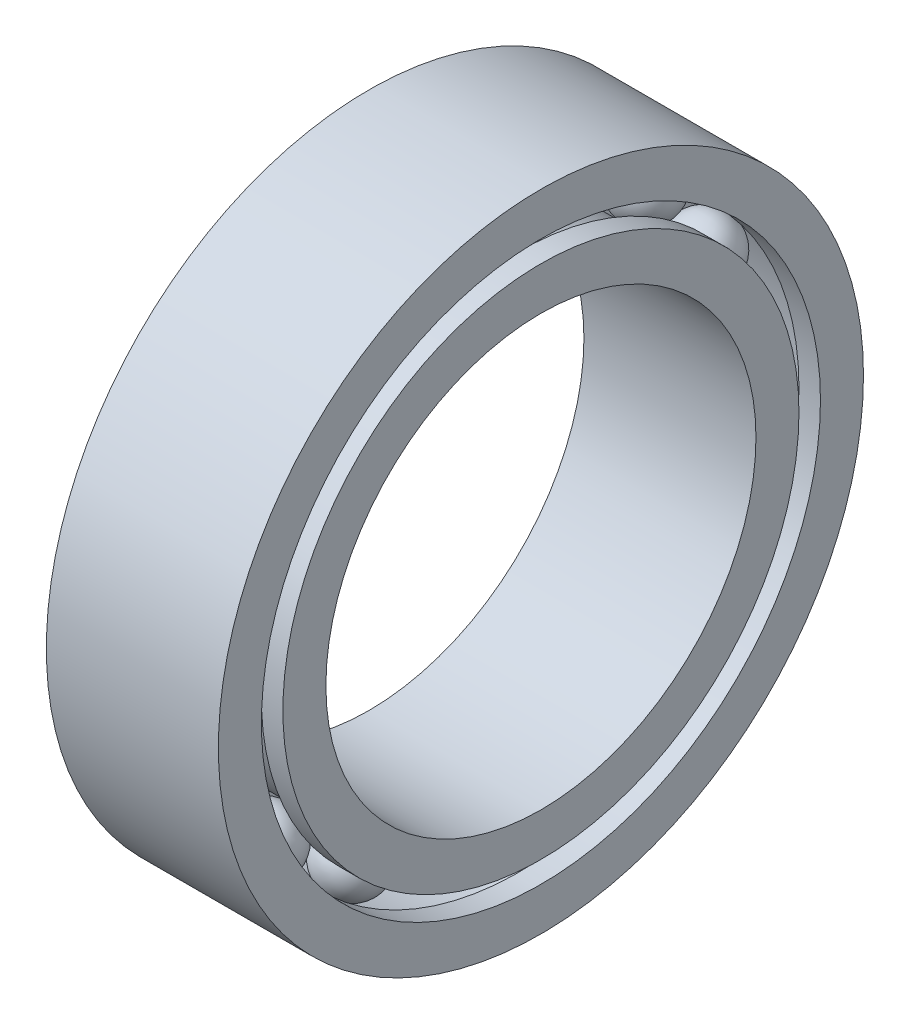
ISO-10303-21;
HEADER;
FILE_DESCRIPTION(('STEP AP214'),'2;1');
FILE_NAME('part.step','',(''),(''),'','','');
FILE_SCHEMA(('AUTOMOTIVE_DESIGN { 1 0 10303 214 1 1 1 1 }'));
ENDSEC;
DATA;
#1=APPLICATION_CONTEXT('core data for automotive mechanical design processes');
#2=APPLICATION_PROTOCOL_DEFINITION('international standard','automotive_design',2000,#1);
#3=PRODUCT_CONTEXT('',#1,'mechanical');
#4=PRODUCT('Part','Part','',(#3));
#5=PRODUCT_RELATED_PRODUCT_CATEGORY('part','',(#4));
#6=PRODUCT_DEFINITION_FORMATION('','',#4);
#7=PRODUCT_DEFINITION_CONTEXT('part definition',#1,'design');
#8=PRODUCT_DEFINITION('design','',#6,#7);
#9=PRODUCT_DEFINITION_SHAPE('','',#8);
#10=(LENGTH_UNIT() NAMED_UNIT(*) SI_UNIT(.MILLI.,.METRE.));
#11=(NAMED_UNIT(*) PLANE_ANGLE_UNIT() SI_UNIT($,.RADIAN.));
#12=(NAMED_UNIT(*) SI_UNIT($,.STERADIAN.) SOLID_ANGLE_UNIT());
#13=UNCERTAINTY_MEASURE_WITH_UNIT(LENGTH_MEASURE(1.E-05),#10,'distance_accuracy_value','');
#14=(GEOMETRIC_REPRESENTATION_CONTEXT(3) GLOBAL_UNCERTAINTY_ASSIGNED_CONTEXT((#13)) GLOBAL_UNIT_ASSIGNED_CONTEXT((#10,
#11,#12)) REPRESENTATION_CONTEXT('',''));
#15=CARTESIAN_POINT('',(0.,0.,0.));
#16=DIRECTION('',(0.,0.,1.));
#17=DIRECTION('',(1.,0.,0.));
#18=AXIS2_PLACEMENT_3D('',#15,#16,#17);
#19=CARTESIAN_POINT('',(0.,5.77424707819557,-2.39177145228173));
#20=DIRECTION('',(0.,0.923879532511292,-0.382683432365077));
#21=DIRECTION('',(0.,-0.382683432365077,-0.923879532511292));
#22=AXIS2_PLACEMENT_3D('',#19,#20,#21);
#23=SPHERICAL_SURFACE('',#22,0.750000000000001);
#24=CARTESIAN_POINT('',(0.,6.46715672757905,-2.67878402655554));
#25=VERTEX_POINT('',#24);
#26=VERTEX_LOOP('',#25);
#27=FACE_BOUND('',#26,.T.);
#28=ADVANCED_FACE('F72',(#27),#23,.T.);
#29=CLOSED_SHELL('',(#28));
#30=MANIFOLD_SOLID_BREP('B2',#29);
#31=CARTESIAN_POINT('',(0.,4.41941738241598,-4.41941738241587));
#32=DIRECTION('',(0.,0.707106781186556,-0.707106781186539));
#33=DIRECTION('',(0.,-0.707106781186539,-0.707106781186556));
#34=AXIS2_PLACEMENT_3D('',#31,#32,#33);
#35=SPHERICAL_SURFACE('',#34,0.750000000000001);
#36=CARTESIAN_POINT('',(0.,4.94974746830589,-4.94974746830577));
#37=VERTEX_POINT('',#36);
#38=VERTEX_LOOP('',#37);
#39=FACE_BOUND('',#38,.T.);
#40=ADVANCED_FACE('F87',(#39),#35,.T.);
#41=CLOSED_SHELL('',(#40));
#42=MANIFOLD_SOLID_BREP('B7',#41);
#43=CARTESIAN_POINT('',(0.,2.39177145228187,-5.77424707819552));
#44=DIRECTION('',(0.,0.3826834323651,-0.923879532511283));
#45=DIRECTION('',(0.,-0.923879532511283,-0.3826834323651));
#46=AXIS2_PLACEMENT_3D('',#43,#44,#45);
#47=SPHERICAL_SURFACE('',#46,0.750000000000001);
#48=CARTESIAN_POINT('',(0.,2.6787840265557,-6.46715672757898));
#49=VERTEX_POINT('',#48);
#50=VERTEX_LOOP('',#49);
#51=FACE_BOUND('',#50,.T.);
#52=ADVANCED_FACE('F102',(#51),#47,.T.);
#53=CLOSED_SHELL('',(#52));
#54=MANIFOLD_SOLID_BREP('B67',#53);
#55=CARTESIAN_POINT('',(0.,0.,-6.25));
#56=DIRECTION('',(0.,0.,-1.));
#57=DIRECTION('',(0.,-1.,0.));
#58=AXIS2_PLACEMENT_3D('',#55,#56,#57);
#59=SPHERICAL_SURFACE('',#58,0.750000000000001);
#60=CARTESIAN_POINT('',(0.,0.,-7.));
#61=VERTEX_POINT('',#60);
#62=VERTEX_LOOP('',#61);
#63=FACE_BOUND('',#62,.T.);
#64=ADVANCED_FACE('F122',(#63),#59,.T.);
#65=CLOSED_SHELL('',(#64));
#66=MANIFOLD_SOLID_BREP('B83',#65);
#67=CARTESIAN_POINT('',(0.,-2.39177145228175,-5.77424707819557));
#68=DIRECTION('',(0.,-0.382683432365081,-0.923879532511291));
#69=DIRECTION('',(0.,-0.923879532511291,0.382683432365081));
#70=AXIS2_PLACEMENT_3D('',#67,#68,#69);
#71=SPHERICAL_SURFACE('',#70,0.750000000000001);
#72=CARTESIAN_POINT('',(0.,-2.67878402655556,-6.46715672757904));
#73=VERTEX_POINT('',#72);
#74=VERTEX_LOOP('',#73);
#75=FACE_BOUND('',#74,.T.);
#76=ADVANCED_FACE('F140',(#75),#71,.T.);
#77=CLOSED_SHELL('',(#76));
#78=MANIFOLD_SOLID_BREP('B103',#77);
#79=CARTESIAN_POINT('',(0.,-4.41941738241588,-4.41941738241596));
#80=DIRECTION('',(0.,-0.707106781186541,-0.707106781186554));
#81=DIRECTION('',(0.,-0.707106781186554,0.707106781186541));
#82=AXIS2_PLACEMENT_3D('',#79,#80,#81);
#83=SPHERICAL_SURFACE('',#82,0.750000000000001);
#84=CARTESIAN_POINT('',(0.,-4.94974746830579,-4.94974746830588));
#85=VERTEX_POINT('',#84);
#86=VERTEX_LOOP('',#85);
#87=FACE_BOUND('',#86,.T.);
#88=ADVANCED_FACE('F151',(#87),#83,.T.);
#89=CLOSED_SHELL('',(#88));
#90=MANIFOLD_SOLID_BREP('B120',#89);
#91=CARTESIAN_POINT('',(0.,-5.77424707819552,-2.39177145228186));
#92=DIRECTION('',(0.,-0.923879532511284,-0.382683432365097));
#93=DIRECTION('',(0.,-0.382683432365097,0.923879532511284));
#94=AXIS2_PLACEMENT_3D('',#91,#92,#93);
#95=SPHERICAL_SURFACE('',#94,0.750000000000001);
#96=CARTESIAN_POINT('',(0.,-6.46715672757899,-2.67878402655568));
#97=VERTEX_POINT('',#96);
#98=VERTEX_LOOP('',#97);
#99=FACE_BOUND('',#98,.T.);
#100=ADVANCED_FACE('F169',(#99),#95,.T.);
#101=CLOSED_SHELL('',(#100));
#102=MANIFOLD_SOLID_BREP('B131',#101);
#103=CARTESIAN_POINT('',(0.,-6.25,0.));
#104=DIRECTION('',(0.,-1.,0.));
#105=DIRECTION('',(0.,0.,1.));
#106=AXIS2_PLACEMENT_3D('',#103,#104,#105);
#107=SPHERICAL_SURFACE('',#106,0.750000000000001);
#108=CARTESIAN_POINT('',(0.,-7.,0.));
#109=VERTEX_POINT('',#108);
#110=VERTEX_LOOP('',#109);
#111=FACE_BOUND('',#110,.T.);
#112=ADVANCED_FACE('F184',(#111),#107,.T.);
#113=CLOSED_SHELL('',(#112));
#114=MANIFOLD_SOLID_BREP('B146',#113);
#115=CARTESIAN_POINT('',(0.,-5.77424707819556,2.39177145228178));
#116=DIRECTION('',(0.,-0.923879532511289,0.382683432365084));
#117=DIRECTION('',(0.,0.382683432365084,0.923879532511289));
#118=AXIS2_PLACEMENT_3D('',#115,#116,#117);
#119=SPHERICAL_SURFACE('',#118,0.750000000000001);
#120=CARTESIAN_POINT('',(0.,-6.46715672757902,2.67878402655559));
#121=VERTEX_POINT('',#120);
#122=VERTEX_LOOP('',#121);
#123=FACE_BOUND('',#122,.T.);
#124=ADVANCED_FACE('F201',(#123),#119,.T.);
#125=CLOSED_SHELL('',(#124));
#126=MANIFOLD_SOLID_BREP('B164',#125);
#127=CARTESIAN_POINT('',(0.,-4.41941738241595,4.4194173824159));
#128=DIRECTION('',(0.,-0.707106781186551,0.707106781186544));
#129=DIRECTION('',(0.,0.707106781186544,0.707106781186551));
#130=AXIS2_PLACEMENT_3D('',#127,#128,#129);
#131=SPHERICAL_SURFACE('',#130,0.750000000000001);
#132=CARTESIAN_POINT('',(0.,-4.94974746830586,4.94974746830581));
#133=VERTEX_POINT('',#132);
#134=VERTEX_LOOP('',#133);
#135=FACE_BOUND('',#134,.T.);
#136=ADVANCED_FACE('F220',(#135),#131,.T.);
#137=CLOSED_SHELL('',(#136));
#138=MANIFOLD_SOLID_BREP('B181',#137);
#139=CARTESIAN_POINT('',(0.,-2.39177145228184,5.77424707819553));
#140=DIRECTION('',(0.,-0.382683432365094,0.923879532511285));
#141=DIRECTION('',(0.,0.923879532511285,0.382683432365094));
#142=AXIS2_PLACEMENT_3D('',#139,#140,#141);
#143=SPHERICAL_SURFACE('',#142,0.750000000000001);
#144=CARTESIAN_POINT('',(0.,-2.67878402655566,6.467156727579));
#145=VERTEX_POINT('',#144);
#146=VERTEX_LOOP('',#145);
#147=FACE_BOUND('',#146,.T.);
#148=ADVANCED_FACE('F231',(#147),#143,.T.);
#149=CLOSED_SHELL('',(#148));
#150=MANIFOLD_SOLID_BREP('B200',#149);
#151=CARTESIAN_POINT('',(0.,0.,6.25));
#152=DIRECTION('',(0.,0.,1.));
#153=DIRECTION('',(0.,1.,0.));
#154=AXIS2_PLACEMENT_3D('',#151,#152,#153);
#155=SPHERICAL_SURFACE('',#154,0.750000000000001);
#156=CARTESIAN_POINT('',(0.,0.,7.));
#157=VERTEX_POINT('',#156);
#158=VERTEX_LOOP('',#157);
#159=FACE_BOUND('',#158,.T.);
#160=ADVANCED_FACE('F248',(#159),#155,.T.);
#161=CLOSED_SHELL('',(#160));
#162=MANIFOLD_SOLID_BREP('B214',#161);
#163=CARTESIAN_POINT('',(0.,2.3917714522818,5.77424707819555));
#164=DIRECTION('',(0.,0.382683432365087,0.923879532511288));
#165=DIRECTION('',(0.,0.923879532511288,-0.382683432365087));
#166=AXIS2_PLACEMENT_3D('',#163,#164,#165);
#167=SPHERICAL_SURFACE('',#166,0.750000000000001);
#168=CARTESIAN_POINT('',(0.,2.67878402655561,6.46715672757901));
#169=VERTEX_POINT('',#168);
#170=VERTEX_LOOP('',#169);
#171=FACE_BOUND('',#170,.T.);
#172=ADVANCED_FACE('F264',(#171),#167,.T.);
#173=CLOSED_SHELL('',(#172));
#174=MANIFOLD_SOLID_BREP('B230',#173);
#175=CARTESIAN_POINT('',(0.,4.41941738241592,4.41941738241593));
#176=DIRECTION('',(0.,0.707106781186546,0.707106781186549));
#177=DIRECTION('',(0.,0.707106781186549,-0.707106781186546));
#178=AXIS2_PLACEMENT_3D('',#175,#176,#177);
#179=SPHERICAL_SURFACE('',#178,0.750000000000001);
#180=CARTESIAN_POINT('',(0.,4.94974746830583,4.94974746830584));
#181=VERTEX_POINT('',#180);
#182=VERTEX_LOOP('',#181);
#183=FACE_BOUND('',#182,.T.);
#184=ADVANCED_FACE('F283',(#183),#179,.T.);
#185=CLOSED_SHELL('',(#184));
#186=MANIFOLD_SOLID_BREP('B244',#185);
#187=CARTESIAN_POINT('',(0.,5.77424707819554,2.39177145228182));
#188=DIRECTION('',(0.,0.923879532511287,0.382683432365091));
#189=DIRECTION('',(0.,0.382683432365091,-0.923879532511287));
#190=AXIS2_PLACEMENT_3D('',#187,#188,#189);
#191=SPHERICAL_SURFACE('',#190,0.750000000000001);
#192=CARTESIAN_POINT('',(0.,6.46715672757901,2.67878402655564));
#193=VERTEX_POINT('',#192);
#194=VERTEX_LOOP('',#193);
#195=FACE_BOUND('',#194,.T.);
#196=ADVANCED_FACE('F299',(#195),#191,.T.);
#197=CLOSED_SHELL('',(#196));
#198=MANIFOLD_SOLID_BREP('B263',#197);
#199=CARTESIAN_POINT('',(-2.,0.,0.));
#200=DIRECTION('',(1.,0.,0.));
#201=DIRECTION('',(0.,0.,-1.));
#202=AXIS2_PLACEMENT_3D('',#199,#200,#201);
#203=CYLINDRICAL_SURFACE('',#202,7.);
#204=CARTESIAN_POINT('',(-1.5,0.,0.));
#205=DIRECTION('',(-1.,0.,0.));
#206=DIRECTION('',(0.,0.,1.));
#207=AXIS2_PLACEMENT_3D('',#204,#205,#206);
#208=CIRCLE('',#207,7.);
#209=CARTESIAN_POINT('',(-1.5,0.,7.));
#210=VERTEX_POINT('',#209);
#211=EDGE_CURVE('E323',#210,#210,#208,.F.);
#212=ORIENTED_EDGE('',*,*,#211,.F.);
#213=EDGE_LOOP('',(#212));
#214=FACE_BOUND('',#213,.T.);
#215=CARTESIAN_POINT('',(1.5,0.,0.));
#216=DIRECTION('',(1.,0.,0.));
#217=DIRECTION('',(0.,0.,-1.));
#218=AXIS2_PLACEMENT_3D('',#215,#216,#217);
#219=CIRCLE('',#218,7.);
#220=CARTESIAN_POINT('',(1.5,0.,-7.));
#221=VERTEX_POINT('',#220);
#222=EDGE_CURVE('E296',#221,#221,#219,.F.);
#223=ORIENTED_EDGE('',*,*,#222,.F.);
#224=EDGE_LOOP('',(#223));
#225=FACE_BOUND('',#224,.T.);
#226=ADVANCED_FACE('F319',(#214,#225),#203,.F.);
#227=CARTESIAN_POINT('',(-2.,0.,0.));
#228=DIRECTION('',(1.,0.,0.));
#229=DIRECTION('',(0.,0.,-1.));
#230=AXIS2_PLACEMENT_3D('',#227,#228,#229);
#231=CYLINDRICAL_SURFACE('',#230,7.5);
#232=CARTESIAN_POINT('',(-2.,0.,0.));
#233=DIRECTION('',(1.,0.,0.));
#234=DIRECTION('',(0.,0.,-1.));
#235=AXIS2_PLACEMENT_3D('',#232,#233,#234);
#236=CIRCLE('',#235,7.5);
#237=CARTESIAN_POINT('',(-2.,0.,-7.5));
#238=VERTEX_POINT('',#237);
#239=EDGE_CURVE('E329',#238,#238,#236,.T.);
#240=ORIENTED_EDGE('',*,*,#239,.T.);
#241=EDGE_LOOP('',(#240));
#242=FACE_BOUND('',#241,.T.);
#243=CARTESIAN_POINT('',(2.,0.,0.));
#244=DIRECTION('',(1.,0.,0.));
#245=DIRECTION('',(0.,0.,-1.));
#246=AXIS2_PLACEMENT_3D('',#243,#244,#245);
#247=CIRCLE('',#246,7.5);
#248=CARTESIAN_POINT('',(2.,0.,-7.5));
#249=VERTEX_POINT('',#248);
#250=EDGE_CURVE('E334',#249,#249,#247,.T.);
#251=ORIENTED_EDGE('',*,*,#250,.F.);
#252=EDGE_LOOP('',(#251));
#253=FACE_BOUND('',#252,.T.);
#254=ADVANCED_FACE('F379',(#242,#253),#231,.T.);
#255=CARTESIAN_POINT('',(-2.,0.,0.));
#256=DIRECTION('',(1.,0.,0.));
#257=DIRECTION('',(0.,0.,-1.));
#258=AXIS2_PLACEMENT_3D('',#255,#256,#257);
#259=PLANE('',#258);
#260=ORIENTED_EDGE('',*,*,#239,.F.);
#261=EDGE_LOOP('',(#260));
#262=FACE_BOUND('',#261,.T.);
#263=CARTESIAN_POINT('',(-2.,0.,0.));
#264=DIRECTION('',(-1.,0.,0.));
#265=DIRECTION('',(0.,0.,1.));
#266=AXIS2_PLACEMENT_3D('',#263,#264,#265);
#267=CIRCLE('',#266,6.5);
#268=CARTESIAN_POINT('',(-2.,0.,6.5));
#269=VERTEX_POINT('',#268);
#270=EDGE_CURVE('E345',#269,#269,#267,.T.);
#271=ORIENTED_EDGE('',*,*,#270,.F.);
#272=EDGE_LOOP('',(#271));
#273=FACE_BOUND('',#272,.T.);
#274=ADVANCED_FACE('F369',(#262,#273),#259,.F.);
#275=CARTESIAN_POINT('',(2.,0.,0.));
#276=DIRECTION('',(1.,0.,0.));
#277=DIRECTION('',(0.,0.,-1.));
#278=AXIS2_PLACEMENT_3D('',#275,#276,#277);
#279=PLANE('',#278);
#280=ORIENTED_EDGE('',*,*,#250,.T.);
#281=EDGE_LOOP('',(#280));
#282=FACE_BOUND('',#281,.T.);
#283=CARTESIAN_POINT('',(2.,0.,0.));
#284=DIRECTION('',(1.,0.,0.));
#285=DIRECTION('',(0.,0.,-1.));
#286=AXIS2_PLACEMENT_3D('',#283,#284,#285);
#287=CIRCLE('',#286,6.5);
#288=CARTESIAN_POINT('',(2.,0.,-6.5));
#289=VERTEX_POINT('',#288);
#290=EDGE_CURVE('E349',#289,#289,#287,.T.);
#291=ORIENTED_EDGE('',*,*,#290,.F.);
#292=EDGE_LOOP('',(#291));
#293=FACE_BOUND('',#292,.T.);
#294=ADVANCED_FACE('F370',(#282,#293),#279,.T.);
#295=CARTESIAN_POINT('',(-1.5,0.,0.));
#296=DIRECTION('',(-1.,0.,0.));
#297=DIRECTION('',(0.,0.,1.));
#298=AXIS2_PLACEMENT_3D('',#295,#296,#297);
#299=CYLINDRICAL_SURFACE('',#298,6.5);
#300=CARTESIAN_POINT('',(-1.5,0.,0.));
#301=DIRECTION('',(-1.,0.,0.));
#302=DIRECTION('',(0.,0.,1.));
#303=AXIS2_PLACEMENT_3D('',#300,#301,#302);
#304=CIRCLE('',#303,6.5);
#305=CARTESIAN_POINT('',(-1.5,0.,6.5));
#306=VERTEX_POINT('',#305);
#307=EDGE_CURVE('E342',#306,#306,#304,.T.);
#308=ORIENTED_EDGE('',*,*,#307,.F.);
#309=EDGE_LOOP('',(#308));
#310=FACE_BOUND('',#309,.T.);
#311=ORIENTED_EDGE('',*,*,#270,.T.);
#312=EDGE_LOOP('',(#311));
#313=FACE_BOUND('',#312,.T.);
#314=ADVANCED_FACE('F367',(#310,#313),#299,.F.);
#315=CARTESIAN_POINT('',(-1.5,0.,0.));
#316=DIRECTION('',(-1.,0.,0.));
#317=DIRECTION('',(0.,0.,1.));
#318=AXIS2_PLACEMENT_3D('',#315,#316,#317);
#319=PLANE('',#318);
#320=ORIENTED_EDGE('',*,*,#307,.T.);
#321=EDGE_LOOP('',(#320));
#322=FACE_BOUND('',#321,.T.);
#323=ORIENTED_EDGE('',*,*,#211,.T.);
#324=EDGE_LOOP('',(#323));
#325=FACE_BOUND('',#324,.T.);
#326=ADVANCED_FACE('F361',(#322,#325),#319,.F.);
#327=CARTESIAN_POINT('',(1.5,0.,0.));
#328=DIRECTION('',(1.,0.,0.));
#329=DIRECTION('',(0.,0.,-1.));
#330=AXIS2_PLACEMENT_3D('',#327,#328,#329);
#331=CYLINDRICAL_SURFACE('',#330,6.5);
#332=CARTESIAN_POINT('',(1.5,0.,0.));
#333=DIRECTION('',(1.,0.,0.));
#334=DIRECTION('',(0.,0.,-1.));
#335=AXIS2_PLACEMENT_3D('',#332,#333,#334);
#336=CIRCLE('',#335,6.5);
#337=CARTESIAN_POINT('',(1.5,0.,-6.5));
#338=VERTEX_POINT('',#337);
#339=EDGE_CURVE('E348',#338,#338,#336,.T.);
#340=ORIENTED_EDGE('',*,*,#339,.F.);
#341=EDGE_LOOP('',(#340));
#342=FACE_BOUND('',#341,.T.);
#343=ORIENTED_EDGE('',*,*,#290,.T.);
#344=EDGE_LOOP('',(#343));
#345=FACE_BOUND('',#344,.T.);
#346=ADVANCED_FACE('F359',(#342,#345),#331,.F.);
#347=CARTESIAN_POINT('',(1.5,0.,0.));
#348=DIRECTION('',(1.,0.,0.));
#349=DIRECTION('',(0.,0.,-1.));
#350=AXIS2_PLACEMENT_3D('',#347,#348,#349);
#351=PLANE('',#350);
#352=ORIENTED_EDGE('',*,*,#339,.T.);
#353=EDGE_LOOP('',(#352));
#354=FACE_BOUND('',#353,.T.);
#355=ORIENTED_EDGE('',*,*,#222,.T.);
#356=EDGE_LOOP('',(#355));
#357=FACE_BOUND('',#356,.T.);
#358=ADVANCED_FACE('F356',(#354,#357),#351,.F.);
#359=CLOSED_SHELL('',(#226,#254,#274,#294,#314,#326,#346,#358));
#360=MANIFOLD_SOLID_BREP('B280',#359);
#361=CARTESIAN_POINT('',(-2.,0.,0.));
#362=DIRECTION('',(1.,0.,0.));
#363=DIRECTION('',(0.,0.,-1.));
#364=AXIS2_PLACEMENT_3D('',#361,#362,#363);
#365=CYLINDRICAL_SURFACE('',#364,5.5);
#366=CARTESIAN_POINT('',(-1.5,0.,0.));
#367=DIRECTION('',(-1.,0.,0.));
#368=DIRECTION('',(0.,0.,1.));
#369=AXIS2_PLACEMENT_3D('',#366,#367,#368);
#370=CIRCLE('',#369,5.5);
#371=CARTESIAN_POINT('',(-1.5,0.,5.5));
#372=VERTEX_POINT('',#371);
#373=EDGE_CURVE('E468',#372,#372,#370,.T.);
#374=ORIENTED_EDGE('',*,*,#373,.F.);
#375=EDGE_LOOP('',(#374));
#376=FACE_BOUND('',#375,.T.);
#377=CARTESIAN_POINT('',(1.5,0.,0.));
#378=DIRECTION('',(1.,0.,0.));
#379=DIRECTION('',(0.,0.,-1.));
#380=AXIS2_PLACEMENT_3D('',#377,#378,#379);
#381=CIRCLE('',#380,5.5);
#382=CARTESIAN_POINT('',(1.5,0.,-5.5));
#383=VERTEX_POINT('',#382);
#384=EDGE_CURVE('E485',#383,#383,#381,.T.);
#385=ORIENTED_EDGE('',*,*,#384,.F.);
#386=EDGE_LOOP('',(#385));
#387=FACE_BOUND('',#386,.T.);
#388=ADVANCED_FACE('F453',(#376,#387),#365,.T.);
#389=CARTESIAN_POINT('',(-2.,0.,0.));
#390=DIRECTION('',(1.,0.,0.));
#391=DIRECTION('',(0.,0.,-1.));
#392=AXIS2_PLACEMENT_3D('',#389,#390,#391);
#393=CYLINDRICAL_SURFACE('',#392,5.);
#394=CARTESIAN_POINT('',(-2.,0.,0.));
#395=DIRECTION('',(1.,0.,0.));
#396=DIRECTION('',(0.,0.,-1.));
#397=AXIS2_PLACEMENT_3D('',#394,#395,#396);
#398=CIRCLE('',#397,5.);
#399=CARTESIAN_POINT('',(-2.,0.,-5.));
#400=VERTEX_POINT('',#399);
#401=EDGE_CURVE('E320',#400,#400,#398,.T.);
#402=ORIENTED_EDGE('',*,*,#401,.F.);
#403=EDGE_LOOP('',(#402));
#404=FACE_BOUND('',#403,.T.);
#405=CARTESIAN_POINT('',(2.,0.,0.));
#406=DIRECTION('',(1.,0.,0.));
#407=DIRECTION('',(0.,0.,-1.));
#408=AXIS2_PLACEMENT_3D('',#405,#406,#407);
#409=CIRCLE('',#408,5.);
#410=CARTESIAN_POINT('',(2.,0.,-5.));
#411=VERTEX_POINT('',#410);
#412=EDGE_CURVE('E465',#411,#411,#409,.T.);
#413=ORIENTED_EDGE('',*,*,#412,.T.);
#414=EDGE_LOOP('',(#413));
#415=FACE_BOUND('',#414,.T.);
#416=ADVANCED_FACE('F460',(#404,#415),#393,.F.);
#417=CARTESIAN_POINT('',(-2.,0.,0.));
#418=DIRECTION('',(1.,0.,0.));
#419=DIRECTION('',(0.,0.,-1.));
#420=AXIS2_PLACEMENT_3D('',#417,#418,#419);
#421=PLANE('',#420);
#422=ORIENTED_EDGE('',*,*,#401,.T.);
#423=EDGE_LOOP('',(#422));
#424=FACE_BOUND('',#423,.T.);
#425=CARTESIAN_POINT('',(-2.,0.,0.));
#426=DIRECTION('',(-1.,0.,0.));
#427=DIRECTION('',(0.,0.,1.));
#428=AXIS2_PLACEMENT_3D('',#425,#426,#427);
#429=CIRCLE('',#428,6.);
#430=CARTESIAN_POINT('',(-2.,0.,6.));
#431=VERTEX_POINT('',#430);
#432=EDGE_CURVE('E474',#431,#431,#429,.T.);
#433=ORIENTED_EDGE('',*,*,#432,.T.);
#434=EDGE_LOOP('',(#433));
#435=FACE_BOUND('',#434,.T.);
#436=ADVANCED_FACE('F498',(#424,#435),#421,.F.);
#437=CARTESIAN_POINT('',(2.,0.,0.));
#438=DIRECTION('',(1.,0.,0.));
#439=DIRECTION('',(0.,0.,-1.));
#440=AXIS2_PLACEMENT_3D('',#437,#438,#439);
#441=PLANE('',#440);
#442=ORIENTED_EDGE('',*,*,#412,.F.);
#443=EDGE_LOOP('',(#442));
#444=FACE_BOUND('',#443,.T.);
#445=CARTESIAN_POINT('',(2.,0.,0.));
#446=DIRECTION('',(1.,0.,0.));
#447=DIRECTION('',(0.,0.,-1.));
#448=AXIS2_PLACEMENT_3D('',#445,#446,#447);
#449=CIRCLE('',#448,6.);
#450=CARTESIAN_POINT('',(2.,0.,-6.));
#451=VERTEX_POINT('',#450);
#452=EDGE_CURVE('E477',#451,#451,#449,.T.);
#453=ORIENTED_EDGE('',*,*,#452,.T.);
#454=EDGE_LOOP('',(#453));
#455=FACE_BOUND('',#454,.T.);
#456=ADVANCED_FACE('F502',(#444,#455),#441,.T.);
#457=CARTESIAN_POINT('',(-1.5,0.,0.));
#458=DIRECTION('',(-1.,0.,0.));
#459=DIRECTION('',(0.,0.,1.));
#460=AXIS2_PLACEMENT_3D('',#457,#458,#459);
#461=CYLINDRICAL_SURFACE('',#460,6.);
#462=CARTESIAN_POINT('',(-1.5,0.,0.));
#463=DIRECTION('',(-1.,0.,0.));
#464=DIRECTION('',(0.,0.,1.));
#465=AXIS2_PLACEMENT_3D('',#462,#463,#464);
#466=CIRCLE('',#465,6.);
#467=CARTESIAN_POINT('',(-1.5,0.,6.));
#468=VERTEX_POINT('',#467);
#469=EDGE_CURVE('E467',#468,#468,#466,.T.);
#470=ORIENTED_EDGE('',*,*,#469,.T.);
#471=EDGE_LOOP('',(#470));
#472=FACE_BOUND('',#471,.T.);
#473=ORIENTED_EDGE('',*,*,#432,.F.);
#474=EDGE_LOOP('',(#473));
#475=FACE_BOUND('',#474,.T.);
#476=ADVANCED_FACE('F506',(#472,#475),#461,.T.);
#477=CARTESIAN_POINT('',(-1.5,0.,0.));
#478=DIRECTION('',(-1.,0.,0.));
#479=DIRECTION('',(0.,0.,1.));
#480=AXIS2_PLACEMENT_3D('',#477,#478,#479);
#481=PLANE('',#480);
#482=ORIENTED_EDGE('',*,*,#373,.T.);
#483=EDGE_LOOP('',(#482));
#484=FACE_BOUND('',#483,.T.);
#485=ORIENTED_EDGE('',*,*,#469,.F.);
#486=EDGE_LOOP('',(#485));
#487=FACE_BOUND('',#486,.T.);
#488=ADVANCED_FACE('F509',(#484,#487),#481,.F.);
#489=CARTESIAN_POINT('',(1.5,0.,0.));
#490=DIRECTION('',(1.,0.,0.));
#491=DIRECTION('',(0.,0.,-1.));
#492=AXIS2_PLACEMENT_3D('',#489,#490,#491);
#493=CYLINDRICAL_SURFACE('',#492,6.);
#494=CARTESIAN_POINT('',(1.5,0.,0.));
#495=DIRECTION('',(1.,0.,0.));
#496=DIRECTION('',(0.,0.,-1.));
#497=AXIS2_PLACEMENT_3D('',#494,#495,#496);
#498=CIRCLE('',#497,6.);
#499=CARTESIAN_POINT('',(1.5,0.,-6.));
#500=VERTEX_POINT('',#499);
#501=EDGE_CURVE('E473',#500,#500,#498,.T.);
#502=ORIENTED_EDGE('',*,*,#501,.T.);
#503=EDGE_LOOP('',(#502));
#504=FACE_BOUND('',#503,.T.);
#505=ORIENTED_EDGE('',*,*,#452,.F.);
#506=EDGE_LOOP('',(#505));
#507=FACE_BOUND('',#506,.T.);
#508=ADVANCED_FACE('F514',(#504,#507),#493,.T.);
#509=CARTESIAN_POINT('',(1.5,0.,0.));
#510=DIRECTION('',(1.,0.,0.));
#511=DIRECTION('',(0.,0.,-1.));
#512=AXIS2_PLACEMENT_3D('',#509,#510,#511);
#513=PLANE('',#512);
#514=ORIENTED_EDGE('',*,*,#384,.T.);
#515=EDGE_LOOP('',(#514));
#516=FACE_BOUND('',#515,.T.);
#517=ORIENTED_EDGE('',*,*,#501,.F.);
#518=EDGE_LOOP('',(#517));
#519=FACE_BOUND('',#518,.T.);
#520=ADVANCED_FACE('F486',(#516,#519),#513,.F.);
#521=CLOSED_SHELL('',(#388,#416,#436,#456,#476,#488,#508,#520));
#522=MANIFOLD_SOLID_BREP('B291',#521);
#523=CARTESIAN_POINT('',(0.,6.25,0.));
#524=DIRECTION('',(0.,1.,0.));
#525=DIRECTION('',(0.,0.,-1.));
#526=AXIS2_PLACEMENT_3D('',#523,#524,#525);
#527=SPHERICAL_SURFACE('',#526,0.750000000000001);
#528=CARTESIAN_POINT('',(0.,7.,0.));
#529=VERTEX_POINT('',#528);
#530=VERTEX_LOOP('',#529);
#531=FACE_BOUND('',#530,.T.);
#532=ADVANCED_FACE('F579',(#531),#527,.T.);
#533=CLOSED_SHELL('',(#532));
#534=MANIFOLD_SOLID_BREP('B315',#533);
#535=ADVANCED_BREP_SHAPE_REPRESENTATION('',(#18,#30,#42,#54,#66,#78,#90,#102,#114,#126,#138,
#150,#162,#174,#186,#198,#360,#522,#534),#14);
#536=SHAPE_DEFINITION_REPRESENTATION(#9,#535);
ENDSEC;
END-ISO-10303-21;
